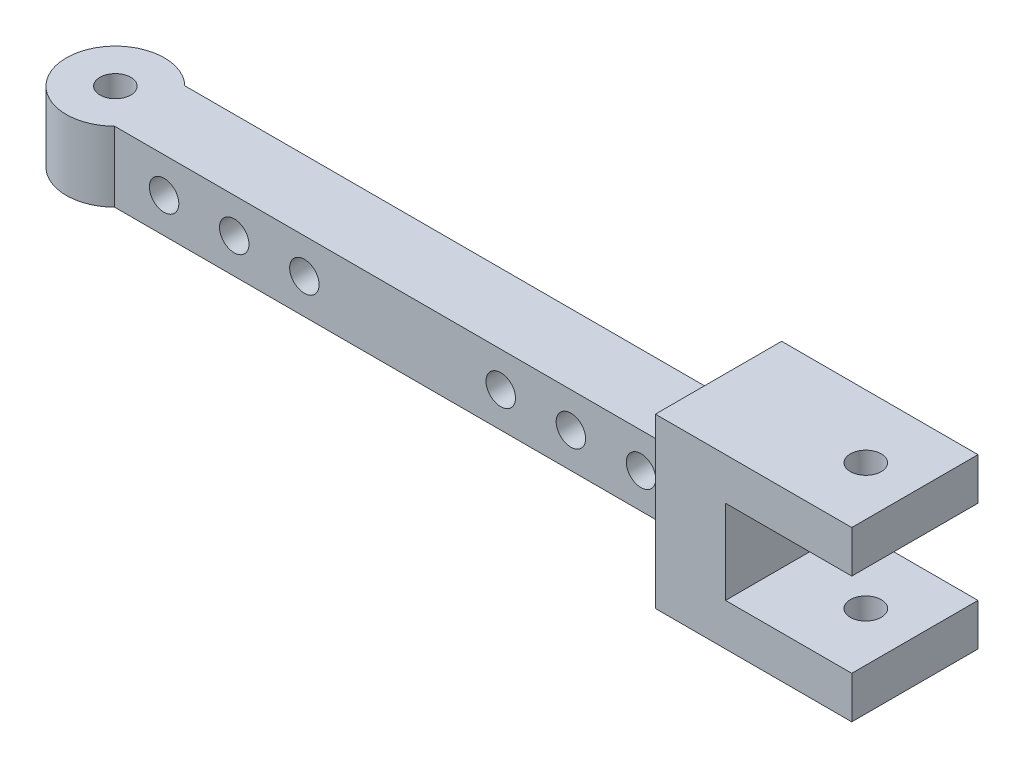
ISO-10303-21;
HEADER;
FILE_DESCRIPTION(('STEP AP214'),'2;1');
FILE_NAME('part.step','',(''),(''),'','','');
FILE_SCHEMA(('AUTOMOTIVE_DESIGN { 1 0 10303 214 1 1 1 1 }'));
ENDSEC;
DATA;
#1=APPLICATION_CONTEXT('core data for automotive mechanical design processes');
#2=APPLICATION_PROTOCOL_DEFINITION('international standard','automotive_design',2000,#1);
#3=PRODUCT_CONTEXT('',#1,'mechanical');
#4=PRODUCT('Part','Part','',(#3));
#5=PRODUCT_RELATED_PRODUCT_CATEGORY('part','',(#4));
#6=PRODUCT_DEFINITION_FORMATION('','',#4);
#7=PRODUCT_DEFINITION_CONTEXT('part definition',#1,'design');
#8=PRODUCT_DEFINITION('design','',#6,#7);
#9=PRODUCT_DEFINITION_SHAPE('','',#8);
#10=(LENGTH_UNIT() NAMED_UNIT(*) SI_UNIT(.MILLI.,.METRE.));
#11=(NAMED_UNIT(*) PLANE_ANGLE_UNIT() SI_UNIT($,.RADIAN.));
#12=(NAMED_UNIT(*) SI_UNIT($,.STERADIAN.) SOLID_ANGLE_UNIT());
#13=UNCERTAINTY_MEASURE_WITH_UNIT(LENGTH_MEASURE(1.E-05),#10,'distance_accuracy_value','');
#14=(GEOMETRIC_REPRESENTATION_CONTEXT(3) GLOBAL_UNCERTAINTY_ASSIGNED_CONTEXT((#13)) GLOBAL_UNIT_ASSIGNED_CONTEXT((#10,
#11,#12)) REPRESENTATION_CONTEXT('',''));
#15=CARTESIAN_POINT('',(0.,0.,0.));
#16=DIRECTION('',(0.,0.,1.));
#17=DIRECTION('',(1.,0.,0.));
#18=AXIS2_PLACEMENT_3D('',#15,#16,#17);
#19=CARTESIAN_POINT('',(32.,-3.5,-4.5));
#20=DIRECTION('',(1.,0.,0.));
#21=DIRECTION('',(0.,0.,-1.));
#22=AXIS2_PLACEMENT_3D('',#19,#20,#21);
#23=PLANE('',#22);
#24=DIRECTION('',(0.,1.,0.));
#25=VECTOR('',#24,1.);
#26=CARTESIAN_POINT('',(32.,-3.5,4.5));
#27=LINE('',#26,#25);
#28=CARTESIAN_POINT('',(32.,5.5,4.5));
#29=VERTEX_POINT('',#28);
#30=CARTESIAN_POINT('',(32.,8.5,4.5));
#31=VERTEX_POINT('',#30);
#32=EDGE_CURVE('E167',#29,#31,#27,.T.);
#33=ORIENTED_EDGE('',*,*,#32,.F.);
#34=DIRECTION('',(0.,0.,-1.));
#35=VECTOR('',#34,1.);
#36=CARTESIAN_POINT('',(32.,5.5,-4.5));
#37=LINE('',#36,#35);
#38=CARTESIAN_POINT('',(32.,5.5,-4.5));
#39=VERTEX_POINT('',#38);
#40=EDGE_CURVE('E208',#29,#39,#37,.T.);
#41=ORIENTED_EDGE('',*,*,#40,.T.);
#42=DIRECTION('',(0.,1.,0.));
#43=VECTOR('',#42,1.);
#44=CARTESIAN_POINT('',(32.,-3.5,-4.5));
#45=LINE('',#44,#43);
#46=CARTESIAN_POINT('',(32.,8.5,-4.5));
#47=VERTEX_POINT('',#46);
#48=EDGE_CURVE('E163',#39,#47,#45,.T.);
#49=ORIENTED_EDGE('',*,*,#48,.T.);
#50=DIRECTION('',(0.,0.,-1.));
#51=VECTOR('',#50,1.);
#52=CARTESIAN_POINT('',(32.,8.5,-4.5));
#53=LINE('',#52,#51);
#54=EDGE_CURVE('E180',#31,#47,#53,.T.);
#55=ORIENTED_EDGE('',*,*,#54,.F.);
#56=EDGE_LOOP('',(#33,#41,#49,#55));
#57=FACE_BOUND('',#56,.T.);
#58=ADVANCED_FACE('F35',(#57),#23,.T.);
#59=DIRECTION('',(0.,0.,-1.));
#60=VECTOR('',#59,1.);
#61=CARTESIAN_POINT('',(32.,-0.5,-4.5));
#62=LINE('',#61,#60);
#63=CARTESIAN_POINT('',(32.,-0.5,4.5));
#64=VERTEX_POINT('',#63);
#65=CARTESIAN_POINT('',(32.,-0.5,-4.5));
#66=VERTEX_POINT('',#65);
#67=EDGE_CURVE('E203',#64,#66,#62,.T.);
#68=ORIENTED_EDGE('',*,*,#67,.F.);
#69=CARTESIAN_POINT('',(32.,-3.5,4.5));
#70=VERTEX_POINT('',#69);
#71=EDGE_CURVE('E158',#70,#64,#27,.T.);
#72=ORIENTED_EDGE('',*,*,#71,.F.);
#73=DIRECTION('',(0.,0.,-1.));
#74=VECTOR('',#73,1.);
#75=CARTESIAN_POINT('',(32.,-3.5,-4.5));
#76=LINE('',#75,#74);
#77=CARTESIAN_POINT('',(32.,-3.5,-4.5));
#78=VERTEX_POINT('',#77);
#79=EDGE_CURVE('E173',#70,#78,#76,.T.);
#80=ORIENTED_EDGE('',*,*,#79,.T.);
#81=EDGE_CURVE('E159',#78,#66,#45,.T.);
#82=ORIENTED_EDGE('',*,*,#81,.T.);
#83=EDGE_LOOP('',(#68,#72,#80,#82));
#84=FACE_BOUND('',#83,.T.);
#85=ADVANCED_FACE('F312',(#84),#23,.T.);
#86=CARTESIAN_POINT('',(18.,-3.5,4.5));
#87=DIRECTION('',(0.,0.,1.));
#88=DIRECTION('',(1.,0.,0.));
#89=AXIS2_PLACEMENT_3D('',#86,#87,#88);
#90=PLANE('',#89);
#91=DIRECTION('',(1.,0.,0.));
#92=VECTOR('',#91,1.);
#93=CARTESIAN_POINT('',(32.,-0.5,4.5));
#94=LINE('',#93,#92);
#95=CARTESIAN_POINT('',(23.,-0.5,4.5));
#96=VERTEX_POINT('',#95);
#97=EDGE_CURVE('E197',#96,#64,#94,.T.);
#98=ORIENTED_EDGE('',*,*,#97,.F.);
#99=DIRECTION('',(0.,1.,0.));
#100=VECTOR('',#99,1.);
#101=CARTESIAN_POINT('',(23.,-0.5,4.5));
#102=LINE('',#101,#100);
#103=CARTESIAN_POINT('',(23.,5.5,4.5));
#104=VERTEX_POINT('',#103);
#105=EDGE_CURVE('E183',#96,#104,#102,.T.);
#106=ORIENTED_EDGE('',*,*,#105,.T.);
#107=DIRECTION('',(1.,0.,0.));
#108=VECTOR('',#107,1.);
#109=CARTESIAN_POINT('',(32.,5.5,4.5));
#110=LINE('',#109,#108);
#111=EDGE_CURVE('E200',#104,#29,#110,.T.);
#112=ORIENTED_EDGE('',*,*,#111,.T.);
#113=ORIENTED_EDGE('',*,*,#32,.T.);
#114=DIRECTION('',(1.,0.,0.));
#115=VECTOR('',#114,1.);
#116=CARTESIAN_POINT('',(18.,8.5,4.5));
#117=LINE('',#116,#115);
#118=CARTESIAN_POINT('',(18.,8.5,4.5));
#119=VERTEX_POINT('',#118);
#120=EDGE_CURVE('E170',#119,#31,#117,.T.);
#121=ORIENTED_EDGE('',*,*,#120,.F.);
#122=DIRECTION('',(0.,1.,0.));
#123=VECTOR('',#122,1.);
#124=CARTESIAN_POINT('',(18.,-3.5,4.5));
#125=LINE('',#124,#123);
#126=CARTESIAN_POINT('',(18.,-3.5,4.5));
#127=VERTEX_POINT('',#126);
#128=EDGE_CURVE('E165',#127,#119,#125,.T.);
#129=ORIENTED_EDGE('',*,*,#128,.F.);
#130=DIRECTION('',(1.,0.,0.));
#131=VECTOR('',#130,1.);
#132=CARTESIAN_POINT('',(18.,-3.5,4.5));
#133=LINE('',#132,#131);
#134=EDGE_CURVE('E184',#127,#70,#133,.T.);
#135=ORIENTED_EDGE('',*,*,#134,.T.);
#136=ORIENTED_EDGE('',*,*,#71,.T.);
#137=EDGE_LOOP('',(#98,#106,#112,#113,#121,#129,#135,#136));
#138=FACE_BOUND('',#137,.T.);
#139=ADVANCED_FACE('F318',(#138),#90,.T.);
#140=CARTESIAN_POINT('',(18.,-3.5,-4.5));
#141=DIRECTION('',(-1.,0.,0.));
#142=DIRECTION('',(0.,0.,1.));
#143=AXIS2_PLACEMENT_3D('',#140,#141,#142);
#144=PLANE('',#143);
#145=DIRECTION('',(0.,-1.,0.));
#146=VECTOR('',#145,1.);
#147=CARTESIAN_POINT('',(18.,5.,-2.5));
#148=LINE('',#147,#146);
#149=CARTESIAN_POINT('',(18.,5.,-2.5));
#150=VERTEX_POINT('',#149);
#151=CARTESIAN_POINT('',(18.,0.,-2.5));
#152=VERTEX_POINT('',#151);
#153=EDGE_CURVE('E153',#150,#152,#148,.T.);
#154=ORIENTED_EDGE('',*,*,#153,.F.);
#155=DIRECTION('',(0.,0.,1.));
#156=VECTOR('',#155,1.);
#157=CARTESIAN_POINT('',(18.,5.,0.));
#158=LINE('',#157,#156);
#159=CARTESIAN_POINT('',(18.,5.,2.5));
#160=VERTEX_POINT('',#159);
#161=EDGE_CURVE('E147',#150,#160,#158,.T.);
#162=ORIENTED_EDGE('',*,*,#161,.T.);
#163=DIRECTION('',(0.,1.,0.));
#164=VECTOR('',#163,1.);
#165=CARTESIAN_POINT('',(18.,5.,2.5));
#166=LINE('',#165,#164);
#167=CARTESIAN_POINT('',(18.,0.,2.5));
#168=VERTEX_POINT('',#167);
#169=EDGE_CURVE('E156',#168,#160,#166,.T.);
#170=ORIENTED_EDGE('',*,*,#169,.F.);
#171=DIRECTION('',(0.,0.,1.));
#172=VECTOR('',#171,1.);
#173=CARTESIAN_POINT('',(18.,0.,0.));
#174=LINE('',#173,#172);
#175=EDGE_CURVE('E11',#152,#168,#174,.T.);
#176=ORIENTED_EDGE('',*,*,#175,.F.);
#177=EDGE_LOOP('',(#154,#162,#170,#176));
#178=FACE_BOUND('',#177,.T.);
#179=DIRECTION('',(0.,0.,1.));
#180=VECTOR('',#179,1.);
#181=CARTESIAN_POINT('',(18.,8.5,-4.5));
#182=LINE('',#181,#180);
#183=CARTESIAN_POINT('',(18.,8.5,-4.5));
#184=VERTEX_POINT('',#183);
#185=EDGE_CURVE('E174',#184,#119,#182,.T.);
#186=ORIENTED_EDGE('',*,*,#185,.F.);
#187=DIRECTION('',(0.,1.,0.));
#188=VECTOR('',#187,1.);
#189=CARTESIAN_POINT('',(18.,-3.5,-4.5));
#190=LINE('',#189,#188);
#191=CARTESIAN_POINT('',(18.,-3.5,-4.5));
#192=VERTEX_POINT('',#191);
#193=EDGE_CURVE('E162',#192,#184,#190,.T.);
#194=ORIENTED_EDGE('',*,*,#193,.F.);
#195=DIRECTION('',(0.,0.,1.));
#196=VECTOR('',#195,1.);
#197=CARTESIAN_POINT('',(18.,-3.5,-4.5));
#198=LINE('',#197,#196);
#199=EDGE_CURVE('E187',#192,#127,#198,.T.);
#200=ORIENTED_EDGE('',*,*,#199,.T.);
#201=ORIENTED_EDGE('',*,*,#128,.T.);
#202=EDGE_LOOP('',(#186,#194,#200,#201));
#203=FACE_BOUND('',#202,.T.);
#204=ADVANCED_FACE('F344',(#178,#203),#144,.T.);
#205=CARTESIAN_POINT('',(18.,-3.5,-4.5));
#206=DIRECTION('',(0.,0.,-1.));
#207=DIRECTION('',(-1.,0.,0.));
#208=AXIS2_PLACEMENT_3D('',#205,#206,#207);
#209=PLANE('',#208);
#210=DIRECTION('',(-1.,0.,0.));
#211=VECTOR('',#210,1.);
#212=CARTESIAN_POINT('',(32.,-0.5,-4.5));
#213=LINE('',#212,#211);
#214=CARTESIAN_POINT('',(23.,-0.5,-4.5));
#215=VERTEX_POINT('',#214);
#216=EDGE_CURVE('E216',#66,#215,#213,.T.);
#217=ORIENTED_EDGE('',*,*,#216,.F.);
#218=ORIENTED_EDGE('',*,*,#81,.F.);
#219=DIRECTION('',(-1.,0.,0.));
#220=VECTOR('',#219,1.);
#221=CARTESIAN_POINT('',(18.,-3.5,-4.5));
#222=LINE('',#221,#220);
#223=EDGE_CURVE('E190',#78,#192,#222,.T.);
#224=ORIENTED_EDGE('',*,*,#223,.T.);
#225=ORIENTED_EDGE('',*,*,#193,.T.);
#226=DIRECTION('',(-1.,0.,0.));
#227=VECTOR('',#226,1.);
#228=CARTESIAN_POINT('',(18.,8.5,-4.5));
#229=LINE('',#228,#227);
#230=EDGE_CURVE('E177',#47,#184,#229,.T.);
#231=ORIENTED_EDGE('',*,*,#230,.F.);
#232=ORIENTED_EDGE('',*,*,#48,.F.);
#233=DIRECTION('',(-1.,0.,0.));
#234=VECTOR('',#233,1.);
#235=CARTESIAN_POINT('',(32.,5.5,-4.5));
#236=LINE('',#235,#234);
#237=CARTESIAN_POINT('',(23.,5.5,-4.5));
#238=VERTEX_POINT('',#237);
#239=EDGE_CURVE('E205',#39,#238,#236,.T.);
#240=ORIENTED_EDGE('',*,*,#239,.T.);
#241=DIRECTION('',(0.,1.,0.));
#242=VECTOR('',#241,1.);
#243=CARTESIAN_POINT('',(23.,-0.5,-4.5));
#244=LINE('',#243,#242);
#245=EDGE_CURVE('E195',#215,#238,#244,.T.);
#246=ORIENTED_EDGE('',*,*,#245,.F.);
#247=EDGE_LOOP('',(#217,#218,#224,#225,#231,#232,#240,#246));
#248=FACE_BOUND('',#247,.T.);
#249=ADVANCED_FACE('F323',(#248),#209,.T.);
#250=CARTESIAN_POINT('',(0.,-3.5,0.));
#251=DIRECTION('',(0.,1.,0.));
#252=DIRECTION('',(0.,0.,1.));
#253=AXIS2_PLACEMENT_3D('',#250,#251,#252);
#254=PLANE('',#253);
#255=CARTESIAN_POINT('',(28.5,-3.5,0.));
#256=DIRECTION('',(0.,1.,0.));
#257=DIRECTION('',(0.,0.,1.));
#258=AXIS2_PLACEMENT_3D('',#255,#256,#257);
#259=CIRCLE('',#258,1.1);
#260=CARTESIAN_POINT('',(28.5,-3.5,1.1));
#261=VERTEX_POINT('',#260);
#262=EDGE_CURVE('E225',#261,#261,#259,.T.);
#263=ORIENTED_EDGE('',*,*,#262,.T.);
#264=EDGE_LOOP('',(#263));
#265=FACE_BOUND('',#264,.T.);
#266=ORIENTED_EDGE('',*,*,#79,.F.);
#267=ORIENTED_EDGE('',*,*,#134,.F.);
#268=ORIENTED_EDGE('',*,*,#199,.F.);
#269=ORIENTED_EDGE('',*,*,#223,.F.);
#270=EDGE_LOOP('',(#266,#267,#268,#269));
#271=FACE_BOUND('',#270,.T.);
#272=ADVANCED_FACE('F360',(#265,#271),#254,.F.);
#273=CARTESIAN_POINT('',(0.,8.5,0.));
#274=DIRECTION('',(0.,1.,0.));
#275=DIRECTION('',(0.,0.,1.));
#276=AXIS2_PLACEMENT_3D('',#273,#274,#275);
#277=PLANE('',#276);
#278=CARTESIAN_POINT('',(28.5,8.5,0.));
#279=DIRECTION('',(0.,1.,0.));
#280=DIRECTION('',(0.,0.,1.));
#281=AXIS2_PLACEMENT_3D('',#278,#279,#280);
#282=CIRCLE('',#281,1.1);
#283=CARTESIAN_POINT('',(28.5,8.5,1.1));
#284=VERTEX_POINT('',#283);
#285=EDGE_CURVE('E222',#284,#284,#282,.T.);
#286=ORIENTED_EDGE('',*,*,#285,.F.);
#287=EDGE_LOOP('',(#286));
#288=FACE_BOUND('',#287,.T.);
#289=ORIENTED_EDGE('',*,*,#54,.T.);
#290=ORIENTED_EDGE('',*,*,#230,.T.);
#291=ORIENTED_EDGE('',*,*,#185,.T.);
#292=ORIENTED_EDGE('',*,*,#120,.T.);
#293=EDGE_LOOP('',(#289,#290,#291,#292));
#294=FACE_BOUND('',#293,.T.);
#295=ADVANCED_FACE('F352',(#288,#294),#277,.T.);
#296=CARTESIAN_POINT('',(-25.,5.,-2.5));
#297=DIRECTION('',(0.,0.,1.));
#298=DIRECTION('',(1.,0.,0.));
#299=AXIS2_PLACEMENT_3D('',#296,#297,#298);
#300=PLANE('',#299);
#301=CARTESIAN_POINT('',(14.9747448713916,2.5,-2.5));
#302=DIRECTION('',(0.,0.,1.));
#303=DIRECTION('',(1.,0.,0.));
#304=AXIS2_PLACEMENT_3D('',#301,#302,#303);
#305=CIRCLE('',#304,1.05);
#306=CARTESIAN_POINT('',(16.0247448713916,2.5,-2.5));
#307=VERTEX_POINT('',#306);
#308=EDGE_CURVE('E264',#307,#307,#305,.T.);
#309=ORIENTED_EDGE('',*,*,#308,.T.);
#310=EDGE_LOOP('',(#309));
#311=FACE_BOUND('',#310,.T.);
#312=CARTESIAN_POINT('',(4.97474487139159,2.5,-2.5));
#313=DIRECTION('',(0.,0.,1.));
#314=DIRECTION('',(1.,0.,0.));
#315=AXIS2_PLACEMENT_3D('',#312,#313,#314);
#316=CIRCLE('',#315,1.05);
#317=CARTESIAN_POINT('',(6.02474487139159,2.5,-2.5));
#318=VERTEX_POINT('',#317);
#319=EDGE_CURVE('E258',#318,#318,#316,.T.);
#320=ORIENTED_EDGE('',*,*,#319,.T.);
#321=EDGE_LOOP('',(#320));
#322=FACE_BOUND('',#321,.T.);
#323=CARTESIAN_POINT('',(-9.02525512860841,2.5,-2.5));
#324=DIRECTION('',(0.,0.,1.));
#325=DIRECTION('',(1.,0.,0.));
#326=AXIS2_PLACEMENT_3D('',#323,#324,#325);
#327=CIRCLE('',#326,1.05);
#328=CARTESIAN_POINT('',(-7.97525512860841,2.5,-2.5));
#329=VERTEX_POINT('',#328);
#330=EDGE_CURVE('E252',#329,#329,#327,.T.);
#331=ORIENTED_EDGE('',*,*,#330,.T.);
#332=EDGE_LOOP('',(#331));
#333=FACE_BOUND('',#332,.T.);
#334=CARTESIAN_POINT('',(-19.0252551286084,2.5,-2.5));
#335=DIRECTION('',(0.,0.,1.));
#336=DIRECTION('',(1.,0.,0.));
#337=AXIS2_PLACEMENT_3D('',#334,#335,#336);
#338=CIRCLE('',#337,1.05);
#339=CARTESIAN_POINT('',(-17.9752551286084,2.5,-2.5));
#340=VERTEX_POINT('',#339);
#341=EDGE_CURVE('E246',#340,#340,#338,.T.);
#342=ORIENTED_EDGE('',*,*,#341,.T.);
#343=EDGE_LOOP('',(#342));
#344=FACE_BOUND('',#343,.T.);
#345=CARTESIAN_POINT('',(9.97474487139159,2.5,-2.5));
#346=DIRECTION('',(0.,0.,1.));
#347=DIRECTION('',(1.,0.,0.));
#348=AXIS2_PLACEMENT_3D('',#345,#346,#347);
#349=CIRCLE('',#348,1.05);
#350=CARTESIAN_POINT('',(11.0247448713916,2.5,-2.5));
#351=VERTEX_POINT('',#350);
#352=EDGE_CURVE('E240',#351,#351,#349,.T.);
#353=ORIENTED_EDGE('',*,*,#352,.T.);
#354=EDGE_LOOP('',(#353));
#355=FACE_BOUND('',#354,.T.);
#356=CARTESIAN_POINT('',(-14.0252551286084,2.5,-2.5));
#357=DIRECTION('',(0.,0.,1.));
#358=DIRECTION('',(1.,0.,0.));
#359=AXIS2_PLACEMENT_3D('',#356,#357,#358);
#360=CIRCLE('',#359,1.05);
#361=CARTESIAN_POINT('',(-12.9752551286084,2.5,-2.5));
#362=VERTEX_POINT('',#361);
#363=EDGE_CURVE('E234',#362,#362,#360,.T.);
#364=ORIENTED_EDGE('',*,*,#363,.T.);
#365=EDGE_LOOP('',(#364));
#366=FACE_BOUND('',#365,.T.);
#367=DIRECTION('',(-1.,0.,0.));
#368=VECTOR('',#367,1.);
#369=CARTESIAN_POINT('',(-25.,0.,-2.5));
#370=LINE('',#369,#368);
#371=CARTESIAN_POINT('',(-22.5505102572168,0.,-2.5));
#372=VERTEX_POINT('',#371);
#373=EDGE_CURVE('E144',#152,#372,#370,.T.);
#374=ORIENTED_EDGE('',*,*,#373,.T.);
#375=DIRECTION('',(0.,1.,0.));
#376=VECTOR('',#375,1.);
#377=CARTESIAN_POINT('',(-22.5505102572168,0.,-2.5));
#378=LINE('',#377,#376);
#379=CARTESIAN_POINT('',(-22.5505102572168,5.,-2.5));
#380=VERTEX_POINT('',#379);
#381=EDGE_CURVE('E130',#372,#380,#378,.T.);
#382=ORIENTED_EDGE('',*,*,#381,.T.);
#383=DIRECTION('',(-1.,0.,0.));
#384=VECTOR('',#383,1.);
#385=CARTESIAN_POINT('',(-25.,5.,-2.5));
#386=LINE('',#385,#384);
#387=EDGE_CURVE('E143',#150,#380,#386,.T.);
#388=ORIENTED_EDGE('',*,*,#387,.F.);
#389=ORIENTED_EDGE('',*,*,#153,.T.);
#390=EDGE_LOOP('',(#374,#382,#388,#389));
#391=FACE_BOUND('',#390,.T.);
#392=ADVANCED_FACE('F37',(#311,#322,#333,#344,#355,#366,#391),#300,.F.);
#393=CARTESIAN_POINT('',(-25.,5.,2.5));
#394=DIRECTION('',(0.,0.,-1.));
#395=DIRECTION('',(-1.,0.,0.));
#396=AXIS2_PLACEMENT_3D('',#393,#394,#395);
#397=PLANE('',#396);
#398=CARTESIAN_POINT('',(14.9747448713916,2.5,2.5));
#399=DIRECTION('',(0.,0.,1.));
#400=DIRECTION('',(1.,0.,0.));
#401=AXIS2_PLACEMENT_3D('',#398,#399,#400);
#402=CIRCLE('',#401,1.05);
#403=CARTESIAN_POINT('',(16.0247448713916,2.5,2.5));
#404=VERTEX_POINT('',#403);
#405=EDGE_CURVE('E267',#404,#404,#402,.T.);
#406=ORIENTED_EDGE('',*,*,#405,.F.);
#407=EDGE_LOOP('',(#406));
#408=FACE_BOUND('',#407,.T.);
#409=CARTESIAN_POINT('',(4.97474487139159,2.5,2.5));
#410=DIRECTION('',(0.,0.,1.));
#411=DIRECTION('',(1.,0.,0.));
#412=AXIS2_PLACEMENT_3D('',#409,#410,#411);
#413=CIRCLE('',#412,1.05);
#414=CARTESIAN_POINT('',(6.02474487139159,2.5,2.5));
#415=VERTEX_POINT('',#414);
#416=EDGE_CURVE('E261',#415,#415,#413,.T.);
#417=ORIENTED_EDGE('',*,*,#416,.F.);
#418=EDGE_LOOP('',(#417));
#419=FACE_BOUND('',#418,.T.);
#420=CARTESIAN_POINT('',(-9.02525512860841,2.5,2.5));
#421=DIRECTION('',(0.,0.,1.));
#422=DIRECTION('',(1.,0.,0.));
#423=AXIS2_PLACEMENT_3D('',#420,#421,#422);
#424=CIRCLE('',#423,1.05);
#425=CARTESIAN_POINT('',(-7.97525512860841,2.5,2.5));
#426=VERTEX_POINT('',#425);
#427=EDGE_CURVE('E255',#426,#426,#424,.T.);
#428=ORIENTED_EDGE('',*,*,#427,.F.);
#429=EDGE_LOOP('',(#428));
#430=FACE_BOUND('',#429,.T.);
#431=CARTESIAN_POINT('',(-19.0252551286084,2.5,2.5));
#432=DIRECTION('',(0.,0.,1.));
#433=DIRECTION('',(1.,0.,0.));
#434=AXIS2_PLACEMENT_3D('',#431,#432,#433);
#435=CIRCLE('',#434,1.05);
#436=CARTESIAN_POINT('',(-17.9752551286084,2.5,2.5));
#437=VERTEX_POINT('',#436);
#438=EDGE_CURVE('E249',#437,#437,#435,.T.);
#439=ORIENTED_EDGE('',*,*,#438,.F.);
#440=EDGE_LOOP('',(#439));
#441=FACE_BOUND('',#440,.T.);
#442=CARTESIAN_POINT('',(9.97474487139159,2.5,2.5));
#443=DIRECTION('',(0.,0.,1.));
#444=DIRECTION('',(1.,0.,0.));
#445=AXIS2_PLACEMENT_3D('',#442,#443,#444);
#446=CIRCLE('',#445,1.05);
#447=CARTESIAN_POINT('',(11.0247448713916,2.5,2.5));
#448=VERTEX_POINT('',#447);
#449=EDGE_CURVE('E243',#448,#448,#446,.T.);
#450=ORIENTED_EDGE('',*,*,#449,.F.);
#451=EDGE_LOOP('',(#450));
#452=FACE_BOUND('',#451,.T.);
#453=CARTESIAN_POINT('',(-14.0252551286084,2.5,2.5));
#454=DIRECTION('',(0.,0.,1.));
#455=DIRECTION('',(1.,0.,0.));
#456=AXIS2_PLACEMENT_3D('',#453,#454,#455);
#457=CIRCLE('',#456,1.05);
#458=CARTESIAN_POINT('',(-12.9752551286084,2.5,2.5));
#459=VERTEX_POINT('',#458);
#460=EDGE_CURVE('E237',#459,#459,#457,.T.);
#461=ORIENTED_EDGE('',*,*,#460,.F.);
#462=EDGE_LOOP('',(#461));
#463=FACE_BOUND('',#462,.T.);
#464=DIRECTION('',(1.,0.,0.));
#465=VECTOR('',#464,1.);
#466=CARTESIAN_POINT('',(-25.,5.,2.5));
#467=LINE('',#466,#465);
#468=CARTESIAN_POINT('',(-22.5505102572168,5.,2.5));
#469=VERTEX_POINT('',#468);
#470=EDGE_CURVE('E44',#469,#160,#467,.T.);
#471=ORIENTED_EDGE('',*,*,#470,.F.);
#472=DIRECTION('',(0.,1.,0.));
#473=VECTOR('',#472,1.);
#474=CARTESIAN_POINT('',(-22.5505102572168,0.,2.5));
#475=LINE('',#474,#473);
#476=CARTESIAN_POINT('',(-22.5505102572168,0.,2.5));
#477=VERTEX_POINT('',#476);
#478=EDGE_CURVE('E127',#469,#477,#475,.F.);
#479=ORIENTED_EDGE('',*,*,#478,.T.);
#480=DIRECTION('',(1.,0.,0.));
#481=VECTOR('',#480,1.);
#482=CARTESIAN_POINT('',(-25.,0.,2.5));
#483=LINE('',#482,#481);
#484=EDGE_CURVE('E139',#477,#168,#483,.T.);
#485=ORIENTED_EDGE('',*,*,#484,.T.);
#486=ORIENTED_EDGE('',*,*,#169,.T.);
#487=EDGE_LOOP('',(#471,#479,#485,#486));
#488=FACE_BOUND('',#487,.T.);
#489=ADVANCED_FACE('F137',(#408,#419,#430,#441,#452,#463,#488),#397,.F.);
#490=CARTESIAN_POINT('',(0.,5.,0.));
#491=DIRECTION('',(0.,1.,0.));
#492=DIRECTION('',(0.,0.,1.));
#493=AXIS2_PLACEMENT_3D('',#490,#491,#492);
#494=PLANE('',#493);
#495=CARTESIAN_POINT('',(-25.,5.,0.));
#496=DIRECTION('',(0.,1.,0.));
#497=DIRECTION('',(0.,0.,1.));
#498=AXIS2_PLACEMENT_3D('',#495,#496,#497);
#499=CIRCLE('',#498,1.1);
#500=CARTESIAN_POINT('',(-25.,5.,1.1));
#501=VERTEX_POINT('',#500);
#502=EDGE_CURVE('E231',#501,#501,#499,.T.);
#503=ORIENTED_EDGE('',*,*,#502,.F.);
#504=EDGE_LOOP('',(#503));
#505=FACE_BOUND('',#504,.T.);
#506=ORIENTED_EDGE('',*,*,#387,.T.);
#507=CARTESIAN_POINT('',(-25.,5.,0.));
#508=DIRECTION('',(0.,1.,0.));
#509=DIRECTION('',(0.,0.,1.));
#510=AXIS2_PLACEMENT_3D('',#507,#508,#509);
#511=CIRCLE('',#510,3.5);
#512=EDGE_CURVE('E51',#380,#469,#511,.T.);
#513=ORIENTED_EDGE('',*,*,#512,.T.);
#514=ORIENTED_EDGE('',*,*,#470,.T.);
#515=ORIENTED_EDGE('',*,*,#161,.F.);
#516=EDGE_LOOP('',(#506,#513,#514,#515));
#517=FACE_BOUND('',#516,.T.);
#518=ADVANCED_FACE('F284',(#505,#517),#494,.T.);
#519=CARTESIAN_POINT('',(0.,0.,0.));
#520=DIRECTION('',(0.,1.,0.));
#521=DIRECTION('',(0.,0.,1.));
#522=AXIS2_PLACEMENT_3D('',#519,#520,#521);
#523=PLANE('',#522);
#524=CARTESIAN_POINT('',(-25.,0.,0.));
#525=DIRECTION('',(0.,1.,0.));
#526=DIRECTION('',(0.,0.,1.));
#527=AXIS2_PLACEMENT_3D('',#524,#525,#526);
#528=CIRCLE('',#527,1.1);
#529=CARTESIAN_POINT('',(-25.,0.,1.1));
#530=VERTEX_POINT('',#529);
#531=EDGE_CURVE('E229',#530,#530,#528,.T.);
#532=ORIENTED_EDGE('',*,*,#531,.T.);
#533=EDGE_LOOP('',(#532));
#534=FACE_BOUND('',#533,.T.);
#535=ORIENTED_EDGE('',*,*,#484,.F.);
#536=CARTESIAN_POINT('',(-25.,0.,0.));
#537=DIRECTION('',(0.,1.,0.));
#538=DIRECTION('',(0.,0.,1.));
#539=AXIS2_PLACEMENT_3D('',#536,#537,#538);
#540=CIRCLE('',#539,3.5);
#541=EDGE_CURVE('E124',#372,#477,#540,.T.);
#542=ORIENTED_EDGE('',*,*,#541,.F.);
#543=ORIENTED_EDGE('',*,*,#373,.F.);
#544=ORIENTED_EDGE('',*,*,#175,.T.);
#545=EDGE_LOOP('',(#535,#542,#543,#544));
#546=FACE_BOUND('',#545,.T.);
#547=ADVANCED_FACE('F142',(#534,#546),#523,.F.);
#548=CARTESIAN_POINT('',(23.,-0.5,-4.5));
#549=DIRECTION('',(-1.,0.,0.));
#550=DIRECTION('',(0.,0.,1.));
#551=AXIS2_PLACEMENT_3D('',#548,#549,#550);
#552=PLANE('',#551);
#553=DIRECTION('',(0.,0.,1.));
#554=VECTOR('',#553,1.);
#555=CARTESIAN_POINT('',(23.,5.5,-4.5));
#556=LINE('',#555,#554);
#557=EDGE_CURVE('E59',#238,#104,#556,.T.);
#558=ORIENTED_EDGE('',*,*,#557,.T.);
#559=ORIENTED_EDGE('',*,*,#105,.F.);
#560=DIRECTION('',(0.,0.,1.));
#561=VECTOR('',#560,1.);
#562=CARTESIAN_POINT('',(23.,-0.5,-4.5));
#563=LINE('',#562,#561);
#564=EDGE_CURVE('E213',#215,#96,#563,.T.);
#565=ORIENTED_EDGE('',*,*,#564,.F.);
#566=ORIENTED_EDGE('',*,*,#245,.T.);
#567=EDGE_LOOP('',(#558,#559,#565,#566));
#568=FACE_BOUND('',#567,.T.);
#569=ADVANCED_FACE('F329',(#568),#552,.F.);
#570=CARTESIAN_POINT('',(0.,-0.5,0.));
#571=DIRECTION('',(0.,-1.,0.));
#572=DIRECTION('',(0.,0.,-1.));
#573=AXIS2_PLACEMENT_3D('',#570,#571,#572);
#574=PLANE('',#573);
#575=CARTESIAN_POINT('',(28.5,-0.5,0.));
#576=DIRECTION('',(0.,-1.,0.));
#577=DIRECTION('',(0.,0.,-1.));
#578=AXIS2_PLACEMENT_3D('',#575,#576,#577);
#579=CIRCLE('',#578,1.1);
#580=CARTESIAN_POINT('',(28.5,-0.5,-1.1));
#581=VERTEX_POINT('',#580);
#582=EDGE_CURVE('E211',#581,#581,#579,.T.);
#583=ORIENTED_EDGE('',*,*,#582,.T.);
#584=EDGE_LOOP('',(#583));
#585=FACE_BOUND('',#584,.T.);
#586=ORIENTED_EDGE('',*,*,#67,.T.);
#587=ORIENTED_EDGE('',*,*,#216,.T.);
#588=ORIENTED_EDGE('',*,*,#564,.T.);
#589=ORIENTED_EDGE('',*,*,#97,.T.);
#590=EDGE_LOOP('',(#586,#587,#588,#589));
#591=FACE_BOUND('',#590,.T.);
#592=ADVANCED_FACE('F334',(#585,#591),#574,.F.);
#593=CARTESIAN_POINT('',(0.,5.5,0.));
#594=DIRECTION('',(0.,-1.,0.));
#595=DIRECTION('',(0.,0.,-1.));
#596=AXIS2_PLACEMENT_3D('',#593,#594,#595);
#597=PLANE('',#596);
#598=CARTESIAN_POINT('',(28.5,5.5,0.));
#599=DIRECTION('',(0.,-1.,0.));
#600=DIRECTION('',(0.,0.,-1.));
#601=AXIS2_PLACEMENT_3D('',#598,#599,#600);
#602=CIRCLE('',#601,1.1);
#603=CARTESIAN_POINT('',(28.5,5.5,-1.1));
#604=VERTEX_POINT('',#603);
#605=EDGE_CURVE('E39',#604,#604,#602,.T.);
#606=ORIENTED_EDGE('',*,*,#605,.F.);
#607=EDGE_LOOP('',(#606));
#608=FACE_BOUND('',#607,.T.);
#609=ORIENTED_EDGE('',*,*,#40,.F.);
#610=ORIENTED_EDGE('',*,*,#111,.F.);
#611=ORIENTED_EDGE('',*,*,#557,.F.);
#612=ORIENTED_EDGE('',*,*,#239,.F.);
#613=EDGE_LOOP('',(#609,#610,#611,#612));
#614=FACE_BOUND('',#613,.T.);
#615=ADVANCED_FACE('F365',(#608,#614),#597,.T.);
#616=CARTESIAN_POINT('',(28.5,-3.5,0.));
#617=DIRECTION('',(0.,1.,0.));
#618=DIRECTION('',(0.,0.,1.));
#619=AXIS2_PLACEMENT_3D('',#616,#617,#618);
#620=CYLINDRICAL_SURFACE('',#619,1.1);
#621=ORIENTED_EDGE('',*,*,#605,.T.);
#622=EDGE_LOOP('',(#621));
#623=FACE_BOUND('',#622,.T.);
#624=ORIENTED_EDGE('',*,*,#285,.T.);
#625=EDGE_LOOP('',(#624));
#626=FACE_BOUND('',#625,.T.);
#627=ADVANCED_FACE('F374',(#623,#626),#620,.F.);
#628=ORIENTED_EDGE('',*,*,#262,.F.);
#629=EDGE_LOOP('',(#628));
#630=FACE_BOUND('',#629,.T.);
#631=ORIENTED_EDGE('',*,*,#582,.F.);
#632=EDGE_LOOP('',(#631));
#633=FACE_BOUND('',#632,.T.);
#634=ADVANCED_FACE('F447',(#630,#633),#620,.F.);
#635=CARTESIAN_POINT('',(-25.,0.,0.));
#636=DIRECTION('',(0.,1.,0.));
#637=DIRECTION('',(0.,0.,1.));
#638=AXIS2_PLACEMENT_3D('',#635,#636,#637);
#639=CYLINDRICAL_SURFACE('',#638,3.5);
#640=ORIENTED_EDGE('',*,*,#381,.F.);
#641=ORIENTED_EDGE('',*,*,#541,.T.);
#642=ORIENTED_EDGE('',*,*,#478,.F.);
#643=ORIENTED_EDGE('',*,*,#512,.F.);
#644=EDGE_LOOP('',(#640,#641,#642,#643));
#645=FACE_BOUND('',#644,.T.);
#646=ADVANCED_FACE('F126',(#645),#639,.T.);
#647=CARTESIAN_POINT('',(-25.,0.,0.));
#648=DIRECTION('',(0.,1.,0.));
#649=DIRECTION('',(0.,0.,1.));
#650=AXIS2_PLACEMENT_3D('',#647,#648,#649);
#651=CYLINDRICAL_SURFACE('',#650,1.1);
#652=ORIENTED_EDGE('',*,*,#531,.F.);
#653=EDGE_LOOP('',(#652));
#654=FACE_BOUND('',#653,.T.);
#655=ORIENTED_EDGE('',*,*,#502,.T.);
#656=EDGE_LOOP('',(#655));
#657=FACE_BOUND('',#656,.T.);
#658=ADVANCED_FACE('F298',(#654,#657),#651,.F.);
#659=CARTESIAN_POINT('',(-14.0252551286084,2.5,-2.5));
#660=DIRECTION('',(0.,0.,1.));
#661=DIRECTION('',(1.,0.,0.));
#662=AXIS2_PLACEMENT_3D('',#659,#660,#661);
#663=CYLINDRICAL_SURFACE('',#662,1.05);
#664=ORIENTED_EDGE('',*,*,#363,.F.);
#665=EDGE_LOOP('',(#664));
#666=FACE_BOUND('',#665,.T.);
#667=ORIENTED_EDGE('',*,*,#460,.T.);
#668=EDGE_LOOP('',(#667));
#669=FACE_BOUND('',#668,.T.);
#670=ADVANCED_FACE('F295',(#666,#669),#663,.F.);
#671=CARTESIAN_POINT('',(9.97474487139159,2.5,-2.5));
#672=DIRECTION('',(0.,0.,1.));
#673=DIRECTION('',(1.,0.,0.));
#674=AXIS2_PLACEMENT_3D('',#671,#672,#673);
#675=CYLINDRICAL_SURFACE('',#674,1.05);
#676=ORIENTED_EDGE('',*,*,#352,.F.);
#677=EDGE_LOOP('',(#676));
#678=FACE_BOUND('',#677,.T.);
#679=ORIENTED_EDGE('',*,*,#449,.T.);
#680=EDGE_LOOP('',(#679));
#681=FACE_BOUND('',#680,.T.);
#682=ADVANCED_FACE('F297',(#678,#681),#675,.F.);
#683=CARTESIAN_POINT('',(-19.0252551286084,2.5,-2.5));
#684=DIRECTION('',(0.,0.,1.));
#685=DIRECTION('',(1.,0.,0.));
#686=AXIS2_PLACEMENT_3D('',#683,#684,#685);
#687=CYLINDRICAL_SURFACE('',#686,1.05);
#688=ORIENTED_EDGE('',*,*,#341,.F.);
#689=EDGE_LOOP('',(#688));
#690=FACE_BOUND('',#689,.T.);
#691=ORIENTED_EDGE('',*,*,#438,.T.);
#692=EDGE_LOOP('',(#691));
#693=FACE_BOUND('',#692,.T.);
#694=ADVANCED_FACE('F305',(#690,#693),#687,.F.);
#695=CARTESIAN_POINT('',(-9.02525512860841,2.5,-2.5));
#696=DIRECTION('',(0.,0.,1.));
#697=DIRECTION('',(1.,0.,0.));
#698=AXIS2_PLACEMENT_3D('',#695,#696,#697);
#699=CYLINDRICAL_SURFACE('',#698,1.05);
#700=ORIENTED_EDGE('',*,*,#330,.F.);
#701=EDGE_LOOP('',(#700));
#702=FACE_BOUND('',#701,.T.);
#703=ORIENTED_EDGE('',*,*,#427,.T.);
#704=EDGE_LOOP('',(#703));
#705=FACE_BOUND('',#704,.T.);
#706=ADVANCED_FACE('F525',(#702,#705),#699,.F.);
#707=CARTESIAN_POINT('',(4.97474487139159,2.5,-2.5));
#708=DIRECTION('',(0.,0.,1.));
#709=DIRECTION('',(1.,0.,0.));
#710=AXIS2_PLACEMENT_3D('',#707,#708,#709);
#711=CYLINDRICAL_SURFACE('',#710,1.05);
#712=ORIENTED_EDGE('',*,*,#319,.F.);
#713=EDGE_LOOP('',(#712));
#714=FACE_BOUND('',#713,.T.);
#715=ORIENTED_EDGE('',*,*,#416,.T.);
#716=EDGE_LOOP('',(#715));
#717=FACE_BOUND('',#716,.T.);
#718=ADVANCED_FACE('F278',(#714,#717),#711,.F.);
#719=CARTESIAN_POINT('',(14.9747448713916,2.5,-2.5));
#720=DIRECTION('',(0.,0.,1.));
#721=DIRECTION('',(1.,0.,0.));
#722=AXIS2_PLACEMENT_3D('',#719,#720,#721);
#723=CYLINDRICAL_SURFACE('',#722,1.05);
#724=ORIENTED_EDGE('',*,*,#308,.F.);
#725=EDGE_LOOP('',(#724));
#726=FACE_BOUND('',#725,.T.);
#727=ORIENTED_EDGE('',*,*,#405,.T.);
#728=EDGE_LOOP('',(#727));
#729=FACE_BOUND('',#728,.T.);
#730=ADVANCED_FACE('F275',(#726,#729),#723,.F.);
#731=CLOSED_SHELL('',(#58,#85,#139,#204,#249,#272,#295,#392,#489,#518,#547,#569,#592,#615,#627,
#634,#646,#658,#670,#682,#694,#706,#718,#730));
#732=MANIFOLD_SOLID_BREP('B2',#731);
#733=ADVANCED_BREP_SHAPE_REPRESENTATION('',(#18,#732),#14);
#734=SHAPE_DEFINITION_REPRESENTATION(#9,#733);
ENDSEC;
END-ISO-10303-21;
